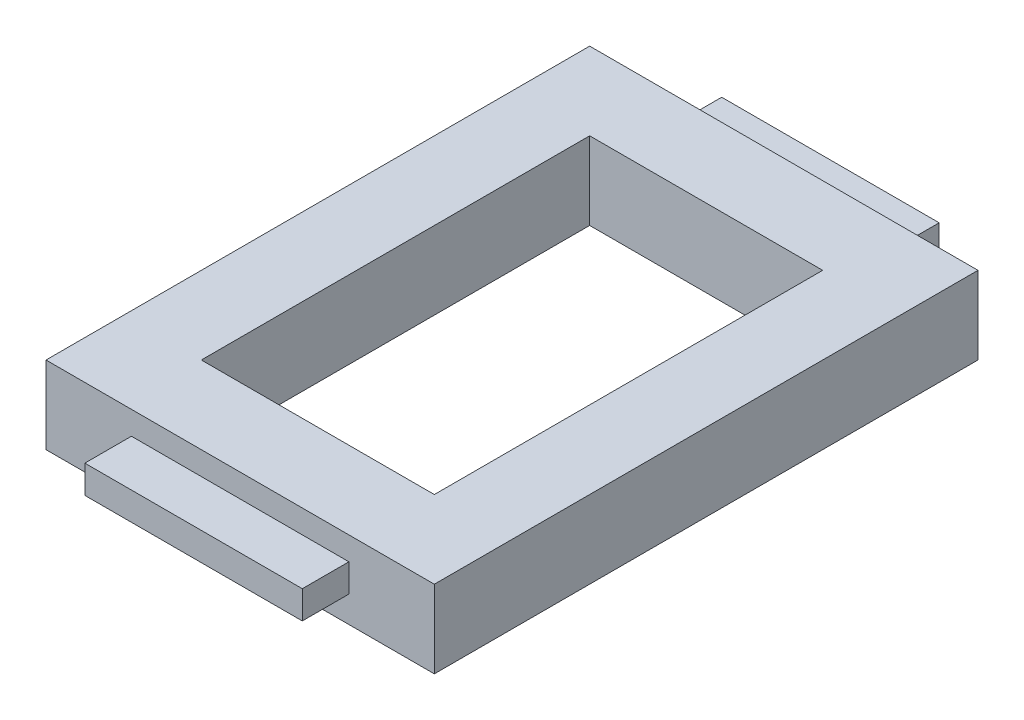
ISO-10303-21;
HEADER;
FILE_DESCRIPTION(('STEP AP214'),'2;1');
FILE_NAME('part.step','',(''),(''),'','','');
FILE_SCHEMA(('AUTOMOTIVE_DESIGN { 1 0 10303 214 1 1 1 1 }'));
ENDSEC;
DATA;
#1=APPLICATION_CONTEXT('core data for automotive mechanical design processes');
#2=APPLICATION_PROTOCOL_DEFINITION('international standard','automotive_design',2000,#1);
#3=PRODUCT_CONTEXT('',#1,'mechanical');
#4=PRODUCT('Part','Part','',(#3));
#5=PRODUCT_RELATED_PRODUCT_CATEGORY('part','',(#4));
#6=PRODUCT_DEFINITION_FORMATION('','',#4);
#7=PRODUCT_DEFINITION_CONTEXT('part definition',#1,'design');
#8=PRODUCT_DEFINITION('design','',#6,#7);
#9=PRODUCT_DEFINITION_SHAPE('','',#8);
#10=(LENGTH_UNIT() NAMED_UNIT(*) SI_UNIT(.MILLI.,.METRE.));
#11=(NAMED_UNIT(*) PLANE_ANGLE_UNIT() SI_UNIT($,.RADIAN.));
#12=(NAMED_UNIT(*) SI_UNIT($,.STERADIAN.) SOLID_ANGLE_UNIT());
#13=UNCERTAINTY_MEASURE_WITH_UNIT(LENGTH_MEASURE(1.E-05),#10,'distance_accuracy_value','');
#14=(GEOMETRIC_REPRESENTATION_CONTEXT(3) GLOBAL_UNCERTAINTY_ASSIGNED_CONTEXT((#13)) GLOBAL_UNIT_ASSIGNED_CONTEXT((#10,
#11,#12)) REPRESENTATION_CONTEXT('',''));
#15=CARTESIAN_POINT('',(0.,0.,0.));
#16=DIRECTION('',(0.,0.,1.));
#17=DIRECTION('',(1.,0.,0.));
#18=AXIS2_PLACEMENT_3D('',#15,#16,#17);
#19=CARTESIAN_POINT('',(0.,5.,-35.));
#20=DIRECTION('',(0.,0.,1.));
#21=DIRECTION('',(1.,0.,0.));
#22=AXIS2_PLACEMENT_3D('',#19,#20,#21);
#23=PLANE('',#22);
#24=DIRECTION('',(-1.,0.,0.));
#25=VECTOR('',#24,1.);
#26=CARTESIAN_POINT('',(0.,0.,-35.));
#27=LINE('',#26,#25);
#28=CARTESIAN_POINT('',(25.,0.,-35.));
#29=VERTEX_POINT('',#28);
#30=CARTESIAN_POINT('',(0.,0.,-35.));
#31=VERTEX_POINT('',#30);
#32=EDGE_CURVE('E240',#29,#31,#27,.T.);
#33=ORIENTED_EDGE('',*,*,#32,.T.);
#34=DIRECTION('',(0.,-1.,0.));
#35=VECTOR('',#34,1.);
#36=CARTESIAN_POINT('',(0.,5.,-35.));
#37=LINE('',#36,#35);
#38=CARTESIAN_POINT('',(0.,5.,-35.));
#39=VERTEX_POINT('',#38);
#40=EDGE_CURVE('E246',#39,#31,#37,.T.);
#41=ORIENTED_EDGE('',*,*,#40,.F.);
#42=DIRECTION('',(-1.,0.,0.));
#43=VECTOR('',#42,1.);
#44=CARTESIAN_POINT('',(0.,5.,-35.));
#45=LINE('',#44,#43);
#46=CARTESIAN_POINT('',(25.,5.,-35.));
#47=VERTEX_POINT('',#46);
#48=EDGE_CURVE('E244',#47,#39,#45,.T.);
#49=ORIENTED_EDGE('',*,*,#48,.F.);
#50=DIRECTION('',(0.,-1.,0.));
#51=VECTOR('',#50,1.);
#52=CARTESIAN_POINT('',(25.,5.,-35.));
#53=LINE('',#52,#51);
#54=EDGE_CURVE('E256',#47,#29,#53,.T.);
#55=ORIENTED_EDGE('',*,*,#54,.T.);
#56=EDGE_LOOP('',(#33,#41,#49,#55));
#57=FACE_BOUND('',#56,.T.);
#58=DIRECTION('',(0.,-1.,0.));
#59=VECTOR('',#58,1.);
#60=CARTESIAN_POINT('',(19.5,3.4,-35.));
#61=LINE('',#60,#59);
#62=CARTESIAN_POINT('',(19.5,3.4,-35.));
#63=VERTEX_POINT('',#62);
#64=CARTESIAN_POINT('',(19.5,1.6,-35.));
#65=VERTEX_POINT('',#64);
#66=EDGE_CURVE('E48',#63,#65,#61,.T.);
#67=ORIENTED_EDGE('',*,*,#66,.F.);
#68=DIRECTION('',(1.,0.,0.));
#69=VECTOR('',#68,1.);
#70=CARTESIAN_POINT('',(19.5,3.4,-35.));
#71=LINE('',#70,#69);
#72=CARTESIAN_POINT('',(5.5,3.4,-35.));
#73=VERTEX_POINT('',#72);
#74=EDGE_CURVE('E52',#73,#63,#71,.T.);
#75=ORIENTED_EDGE('',*,*,#74,.F.);
#76=DIRECTION('',(0.,1.,0.));
#77=VECTOR('',#76,1.);
#78=CARTESIAN_POINT('',(5.5,3.4,-35.));
#79=LINE('',#78,#77);
#80=CARTESIAN_POINT('',(5.5,1.6,-35.));
#81=VERTEX_POINT('',#80);
#82=EDGE_CURVE('E444',#81,#73,#79,.T.);
#83=ORIENTED_EDGE('',*,*,#82,.F.);
#84=DIRECTION('',(-1.,0.,0.));
#85=VECTOR('',#84,1.);
#86=CARTESIAN_POINT('',(19.5,1.6,-35.));
#87=LINE('',#86,#85);
#88=EDGE_CURVE('E450',#65,#81,#87,.T.);
#89=ORIENTED_EDGE('',*,*,#88,.F.);
#90=EDGE_LOOP('',(#67,#75,#83,#89));
#91=FACE_BOUND('',#90,.T.);
#92=ADVANCED_FACE('F33',(#57,#91),#23,.F.);
#93=CARTESIAN_POINT('',(0.,5.,0.));
#94=DIRECTION('',(0.,0.,-1.));
#95=DIRECTION('',(-1.,0.,0.));
#96=AXIS2_PLACEMENT_3D('',#93,#94,#95);
#97=PLANE('',#96);
#98=DIRECTION('',(1.,0.,0.));
#99=VECTOR('',#98,1.);
#100=CARTESIAN_POINT('',(0.,0.,0.));
#101=LINE('',#100,#99);
#102=CARTESIAN_POINT('',(0.,0.,0.));
#103=VERTEX_POINT('',#102);
#104=CARTESIAN_POINT('',(25.,0.,0.));
#105=VERTEX_POINT('',#104);
#106=EDGE_CURVE('E249',#103,#105,#101,.T.);
#107=ORIENTED_EDGE('',*,*,#106,.T.);
#108=DIRECTION('',(0.,-1.,0.));
#109=VECTOR('',#108,1.);
#110=CARTESIAN_POINT('',(25.,5.,0.));
#111=LINE('',#110,#109);
#112=CARTESIAN_POINT('',(25.,5.,0.));
#113=VERTEX_POINT('',#112);
#114=EDGE_CURVE('E41',#113,#105,#111,.T.);
#115=ORIENTED_EDGE('',*,*,#114,.F.);
#116=DIRECTION('',(1.,0.,0.));
#117=VECTOR('',#116,1.);
#118=CARTESIAN_POINT('',(0.,5.,0.));
#119=LINE('',#118,#117);
#120=CARTESIAN_POINT('',(0.,5.,0.));
#121=VERTEX_POINT('',#120);
#122=EDGE_CURVE('E239',#121,#113,#119,.T.);
#123=ORIENTED_EDGE('',*,*,#122,.F.);
#124=DIRECTION('',(0.,-1.,0.));
#125=VECTOR('',#124,1.);
#126=CARTESIAN_POINT('',(0.,5.,0.));
#127=LINE('',#126,#125);
#128=EDGE_CURVE('E11',#121,#103,#127,.T.);
#129=ORIENTED_EDGE('',*,*,#128,.T.);
#130=EDGE_LOOP('',(#107,#115,#123,#129));
#131=FACE_BOUND('',#130,.T.);
#132=DIRECTION('',(0.,-1.,0.));
#133=VECTOR('',#132,1.);
#134=CARTESIAN_POINT('',(5.5,3.5,0.));
#135=LINE('',#134,#133);
#136=CARTESIAN_POINT('',(5.5,3.5,0.));
#137=VERTEX_POINT('',#136);
#138=CARTESIAN_POINT('',(5.5,1.7,0.));
#139=VERTEX_POINT('',#138);
#140=EDGE_CURVE('E166',#137,#139,#135,.T.);
#141=ORIENTED_EDGE('',*,*,#140,.F.);
#142=DIRECTION('',(-1.,0.,0.));
#143=VECTOR('',#142,1.);
#144=CARTESIAN_POINT('',(5.5,3.5,0.));
#145=LINE('',#144,#143);
#146=CARTESIAN_POINT('',(19.5,3.5,0.));
#147=VERTEX_POINT('',#146);
#148=EDGE_CURVE('E179',#147,#137,#145,.T.);
#149=ORIENTED_EDGE('',*,*,#148,.F.);
#150=DIRECTION('',(0.,1.,0.));
#151=VECTOR('',#150,1.);
#152=CARTESIAN_POINT('',(19.5,3.5,0.));
#153=LINE('',#152,#151);
#154=CARTESIAN_POINT('',(19.5,1.7,0.));
#155=VERTEX_POINT('',#154);
#156=EDGE_CURVE('E188',#155,#147,#153,.T.);
#157=ORIENTED_EDGE('',*,*,#156,.F.);
#158=DIRECTION('',(1.,0.,0.));
#159=VECTOR('',#158,1.);
#160=CARTESIAN_POINT('',(5.5,1.7,0.));
#161=LINE('',#160,#159);
#162=EDGE_CURVE('E169',#139,#155,#161,.T.);
#163=ORIENTED_EDGE('',*,*,#162,.F.);
#164=EDGE_LOOP('',(#141,#149,#157,#163));
#165=FACE_BOUND('',#164,.T.);
#166=ADVANCED_FACE('F280',(#131,#165),#97,.F.);
#167=CARTESIAN_POINT('',(0.,5.,0.));
#168=DIRECTION('',(0.,-1.,0.));
#169=DIRECTION('',(0.,0.,-1.));
#170=AXIS2_PLACEMENT_3D('',#167,#168,#169);
#171=PLANE('',#170);
#172=DIRECTION('',(0.,0.,1.));
#173=VECTOR('',#172,1.);
#174=CARTESIAN_POINT('',(0.,5.,0.));
#175=LINE('',#174,#173);
#176=EDGE_CURVE('E236',#39,#121,#175,.T.);
#177=ORIENTED_EDGE('',*,*,#176,.T.);
#178=ORIENTED_EDGE('',*,*,#122,.T.);
#179=DIRECTION('',(0.,0.,-1.));
#180=VECTOR('',#179,1.);
#181=CARTESIAN_POINT('',(25.,5.,0.));
#182=LINE('',#181,#180);
#183=EDGE_CURVE('E242',#113,#47,#182,.T.);
#184=ORIENTED_EDGE('',*,*,#183,.T.);
#185=ORIENTED_EDGE('',*,*,#48,.T.);
#186=EDGE_LOOP('',(#177,#178,#184,#185));
#187=FACE_BOUND('',#186,.T.);
#188=DIRECTION('',(0.,0.,1.));
#189=VECTOR('',#188,1.);
#190=CARTESIAN_POINT('',(5.,5.,-30.));
#191=LINE('',#190,#189);
#192=CARTESIAN_POINT('',(5.,5.,-30.));
#193=VERTEX_POINT('',#192);
#194=CARTESIAN_POINT('',(5.,5.,-5.));
#195=VERTEX_POINT('',#194);
#196=EDGE_CURVE('E205',#193,#195,#191,.T.);
#197=ORIENTED_EDGE('',*,*,#196,.F.);
#198=DIRECTION('',(-1.,0.,0.));
#199=VECTOR('',#198,1.);
#200=CARTESIAN_POINT('',(5.,5.,-30.));
#201=LINE('',#200,#199);
#202=CARTESIAN_POINT('',(20.,5.,-30.));
#203=VERTEX_POINT('',#202);
#204=EDGE_CURVE('E213',#203,#193,#201,.T.);
#205=ORIENTED_EDGE('',*,*,#204,.F.);
#206=DIRECTION('',(0.,0.,-1.));
#207=VECTOR('',#206,1.);
#208=CARTESIAN_POINT('',(20.,5.,-30.));
#209=LINE('',#208,#207);
#210=CARTESIAN_POINT('',(20.,5.,-5.));
#211=VERTEX_POINT('',#210);
#212=EDGE_CURVE('E210',#211,#203,#209,.T.);
#213=ORIENTED_EDGE('',*,*,#212,.F.);
#214=DIRECTION('',(1.,0.,0.));
#215=VECTOR('',#214,1.);
#216=CARTESIAN_POINT('',(5.,5.,-5.));
#217=LINE('',#216,#215);
#218=EDGE_CURVE('E207',#195,#211,#217,.T.);
#219=ORIENTED_EDGE('',*,*,#218,.F.);
#220=EDGE_LOOP('',(#197,#205,#213,#219));
#221=FACE_BOUND('',#220,.T.);
#222=ADVANCED_FACE('F278',(#187,#221),#171,.F.);
#223=CARTESIAN_POINT('',(0.,0.,0.));
#224=DIRECTION('',(0.,-1.,0.));
#225=DIRECTION('',(0.,0.,-1.));
#226=AXIS2_PLACEMENT_3D('',#223,#224,#225);
#227=PLANE('',#226);
#228=DIRECTION('',(0.,0.,1.));
#229=VECTOR('',#228,1.);
#230=CARTESIAN_POINT('',(0.,0.,0.));
#231=LINE('',#230,#229);
#232=EDGE_CURVE('E235',#31,#103,#231,.T.);
#233=ORIENTED_EDGE('',*,*,#232,.F.);
#234=ORIENTED_EDGE('',*,*,#32,.F.);
#235=DIRECTION('',(0.,0.,-1.));
#236=VECTOR('',#235,1.);
#237=CARTESIAN_POINT('',(25.,0.,0.));
#238=LINE('',#237,#236);
#239=EDGE_CURVE('E251',#105,#29,#238,.T.);
#240=ORIENTED_EDGE('',*,*,#239,.F.);
#241=ORIENTED_EDGE('',*,*,#106,.F.);
#242=EDGE_LOOP('',(#233,#234,#240,#241));
#243=FACE_BOUND('',#242,.T.);
#244=DIRECTION('',(-1.,0.,0.));
#245=VECTOR('',#244,1.);
#246=CARTESIAN_POINT('',(5.,0.,-30.));
#247=LINE('',#246,#245);
#248=CARTESIAN_POINT('',(20.,0.,-30.));
#249=VERTEX_POINT('',#248);
#250=CARTESIAN_POINT('',(5.,0.,-30.));
#251=VERTEX_POINT('',#250);
#252=EDGE_CURVE('E208',#249,#251,#247,.T.);
#253=ORIENTED_EDGE('',*,*,#252,.T.);
#254=DIRECTION('',(0.,0.,1.));
#255=VECTOR('',#254,1.);
#256=CARTESIAN_POINT('',(5.,0.,-30.));
#257=LINE('',#256,#255);
#258=CARTESIAN_POINT('',(5.,0.,-5.));
#259=VERTEX_POINT('',#258);
#260=EDGE_CURVE('E204',#251,#259,#257,.T.);
#261=ORIENTED_EDGE('',*,*,#260,.T.);
#262=DIRECTION('',(1.,0.,0.));
#263=VECTOR('',#262,1.);
#264=CARTESIAN_POINT('',(5.,0.,-5.));
#265=LINE('',#264,#263);
#266=CARTESIAN_POINT('',(20.,0.,-5.));
#267=VERTEX_POINT('',#266);
#268=EDGE_CURVE('E218',#259,#267,#265,.T.);
#269=ORIENTED_EDGE('',*,*,#268,.T.);
#270=DIRECTION('',(0.,0.,-1.));
#271=VECTOR('',#270,1.);
#272=CARTESIAN_POINT('',(20.,0.,-30.));
#273=LINE('',#272,#271);
#274=EDGE_CURVE('E221',#267,#249,#273,.T.);
#275=ORIENTED_EDGE('',*,*,#274,.T.);
#276=EDGE_LOOP('',(#253,#261,#269,#275));
#277=FACE_BOUND('',#276,.T.);
#278=ADVANCED_FACE('F269',(#243,#277),#227,.T.);
#279=CARTESIAN_POINT('',(0.,5.,0.));
#280=DIRECTION('',(1.,0.,0.));
#281=DIRECTION('',(0.,0.,-1.));
#282=AXIS2_PLACEMENT_3D('',#279,#280,#281);
#283=PLANE('',#282);
#284=ORIENTED_EDGE('',*,*,#232,.T.);
#285=ORIENTED_EDGE('',*,*,#128,.F.);
#286=ORIENTED_EDGE('',*,*,#176,.F.);
#287=ORIENTED_EDGE('',*,*,#40,.T.);
#288=EDGE_LOOP('',(#284,#285,#286,#287));
#289=FACE_BOUND('',#288,.T.);
#290=ADVANCED_FACE('F35',(#289),#283,.F.);
#291=CARTESIAN_POINT('',(25.,5.,0.));
#292=DIRECTION('',(-1.,0.,0.));
#293=DIRECTION('',(0.,0.,1.));
#294=AXIS2_PLACEMENT_3D('',#291,#292,#293);
#295=PLANE('',#294);
#296=ORIENTED_EDGE('',*,*,#239,.T.);
#297=ORIENTED_EDGE('',*,*,#54,.F.);
#298=ORIENTED_EDGE('',*,*,#183,.F.);
#299=ORIENTED_EDGE('',*,*,#114,.T.);
#300=EDGE_LOOP('',(#296,#297,#298,#299));
#301=FACE_BOUND('',#300,.T.);
#302=ADVANCED_FACE('F263',(#301),#295,.F.);
#303=CARTESIAN_POINT('',(5.,5.,-30.));
#304=DIRECTION('',(1.,0.,0.));
#305=DIRECTION('',(0.,0.,-1.));
#306=AXIS2_PLACEMENT_3D('',#303,#304,#305);
#307=PLANE('',#306);
#308=ORIENTED_EDGE('',*,*,#260,.F.);
#309=DIRECTION('',(0.,-1.,0.));
#310=VECTOR('',#309,1.);
#311=CARTESIAN_POINT('',(5.,5.,-30.));
#312=LINE('',#311,#310);
#313=EDGE_CURVE('E215',#193,#251,#312,.T.);
#314=ORIENTED_EDGE('',*,*,#313,.F.);
#315=ORIENTED_EDGE('',*,*,#196,.T.);
#316=DIRECTION('',(0.,-1.,0.));
#317=VECTOR('',#316,1.);
#318=CARTESIAN_POINT('',(5.,5.,-5.));
#319=LINE('',#318,#317);
#320=EDGE_CURVE('E232',#195,#259,#319,.T.);
#321=ORIENTED_EDGE('',*,*,#320,.T.);
#322=EDGE_LOOP('',(#308,#314,#315,#321));
#323=FACE_BOUND('',#322,.T.);
#324=ADVANCED_FACE('F317',(#323),#307,.T.);
#325=CARTESIAN_POINT('',(5.,5.,-5.));
#326=DIRECTION('',(0.,0.,-1.));
#327=DIRECTION('',(-1.,0.,0.));
#328=AXIS2_PLACEMENT_3D('',#325,#326,#327);
#329=PLANE('',#328);
#330=ORIENTED_EDGE('',*,*,#268,.F.);
#331=ORIENTED_EDGE('',*,*,#320,.F.);
#332=ORIENTED_EDGE('',*,*,#218,.T.);
#333=DIRECTION('',(0.,-1.,0.));
#334=VECTOR('',#333,1.);
#335=CARTESIAN_POINT('',(20.,5.,-5.));
#336=LINE('',#335,#334);
#337=EDGE_CURVE('E230',#211,#267,#336,.T.);
#338=ORIENTED_EDGE('',*,*,#337,.T.);
#339=EDGE_LOOP('',(#330,#331,#332,#338));
#340=FACE_BOUND('',#339,.T.);
#341=ADVANCED_FACE('F322',(#340),#329,.T.);
#342=CARTESIAN_POINT('',(20.,5.,-30.));
#343=DIRECTION('',(-1.,0.,0.));
#344=DIRECTION('',(0.,0.,1.));
#345=AXIS2_PLACEMENT_3D('',#342,#343,#344);
#346=PLANE('',#345);
#347=ORIENTED_EDGE('',*,*,#274,.F.);
#348=ORIENTED_EDGE('',*,*,#337,.F.);
#349=ORIENTED_EDGE('',*,*,#212,.T.);
#350=DIRECTION('',(0.,-1.,0.));
#351=VECTOR('',#350,1.);
#352=CARTESIAN_POINT('',(20.,5.,-30.));
#353=LINE('',#352,#351);
#354=EDGE_CURVE('E228',#203,#249,#353,.T.);
#355=ORIENTED_EDGE('',*,*,#354,.T.);
#356=EDGE_LOOP('',(#347,#348,#349,#355));
#357=FACE_BOUND('',#356,.T.);
#358=ADVANCED_FACE('F336',(#357),#346,.T.);
#359=CARTESIAN_POINT('',(5.,5.,-30.));
#360=DIRECTION('',(0.,0.,1.));
#361=DIRECTION('',(1.,0.,0.));
#362=AXIS2_PLACEMENT_3D('',#359,#360,#361);
#363=PLANE('',#362);
#364=ORIENTED_EDGE('',*,*,#252,.F.);
#365=ORIENTED_EDGE('',*,*,#354,.F.);
#366=ORIENTED_EDGE('',*,*,#204,.T.);
#367=ORIENTED_EDGE('',*,*,#313,.T.);
#368=EDGE_LOOP('',(#364,#365,#366,#367));
#369=FACE_BOUND('',#368,.T.);
#370=ADVANCED_FACE('F307',(#369),#363,.T.);
#371=CARTESIAN_POINT('',(5.5,3.5,3.));
#372=DIRECTION('',(1.,0.,0.));
#373=DIRECTION('',(0.,0.,-1.));
#374=AXIS2_PLACEMENT_3D('',#371,#372,#373);
#375=PLANE('',#374);
#376=ORIENTED_EDGE('',*,*,#140,.T.);
#377=DIRECTION('',(0.,0.,-1.));
#378=VECTOR('',#377,1.);
#379=CARTESIAN_POINT('',(5.5,1.7,3.));
#380=LINE('',#379,#378);
#381=CARTESIAN_POINT('',(5.5,1.7,3.));
#382=VERTEX_POINT('',#381);
#383=EDGE_CURVE('E201',#382,#139,#380,.T.);
#384=ORIENTED_EDGE('',*,*,#383,.F.);
#385=DIRECTION('',(0.,-1.,0.));
#386=VECTOR('',#385,1.);
#387=CARTESIAN_POINT('',(5.5,3.5,3.));
#388=LINE('',#387,#386);
#389=CARTESIAN_POINT('',(5.5,3.5,3.));
#390=VERTEX_POINT('',#389);
#391=EDGE_CURVE('E175',#390,#382,#388,.T.);
#392=ORIENTED_EDGE('',*,*,#391,.F.);
#393=DIRECTION('',(0.,0.,-1.));
#394=VECTOR('',#393,1.);
#395=CARTESIAN_POINT('',(5.5,3.5,3.));
#396=LINE('',#395,#394);
#397=EDGE_CURVE('E184',#390,#137,#396,.T.);
#398=ORIENTED_EDGE('',*,*,#397,.T.);
#399=EDGE_LOOP('',(#376,#384,#392,#398));
#400=FACE_BOUND('',#399,.T.);
#401=ADVANCED_FACE('F291',(#400),#375,.F.);
#402=CARTESIAN_POINT('',(5.5,1.7,3.));
#403=DIRECTION('',(0.,1.,0.));
#404=DIRECTION('',(0.,0.,1.));
#405=AXIS2_PLACEMENT_3D('',#402,#403,#404);
#406=PLANE('',#405);
#407=ORIENTED_EDGE('',*,*,#162,.T.);
#408=DIRECTION('',(0.,0.,-1.));
#409=VECTOR('',#408,1.);
#410=CARTESIAN_POINT('',(19.5,1.7,3.));
#411=LINE('',#410,#409);
#412=CARTESIAN_POINT('',(19.5,1.7,3.));
#413=VERTEX_POINT('',#412);
#414=EDGE_CURVE('E198',#413,#155,#411,.T.);
#415=ORIENTED_EDGE('',*,*,#414,.F.);
#416=DIRECTION('',(1.,0.,0.));
#417=VECTOR('',#416,1.);
#418=CARTESIAN_POINT('',(5.5,1.7,3.));
#419=LINE('',#418,#417);
#420=EDGE_CURVE('E178',#382,#413,#419,.T.);
#421=ORIENTED_EDGE('',*,*,#420,.F.);
#422=ORIENTED_EDGE('',*,*,#383,.T.);
#423=EDGE_LOOP('',(#407,#415,#421,#422));
#424=FACE_BOUND('',#423,.T.);
#425=ADVANCED_FACE('F299',(#424),#406,.F.);
#426=CARTESIAN_POINT('',(19.5,3.5,3.));
#427=DIRECTION('',(-1.,0.,0.));
#428=DIRECTION('',(0.,0.,1.));
#429=AXIS2_PLACEMENT_3D('',#426,#427,#428);
#430=PLANE('',#429);
#431=ORIENTED_EDGE('',*,*,#156,.T.);
#432=DIRECTION('',(0.,0.,-1.));
#433=VECTOR('',#432,1.);
#434=CARTESIAN_POINT('',(19.5,3.5,3.));
#435=LINE('',#434,#433);
#436=CARTESIAN_POINT('',(19.5,3.5,3.));
#437=VERTEX_POINT('',#436);
#438=EDGE_CURVE('E195',#437,#147,#435,.T.);
#439=ORIENTED_EDGE('',*,*,#438,.F.);
#440=DIRECTION('',(0.,1.,0.));
#441=VECTOR('',#440,1.);
#442=CARTESIAN_POINT('',(19.5,3.5,3.));
#443=LINE('',#442,#441);
#444=EDGE_CURVE('E181',#413,#437,#443,.T.);
#445=ORIENTED_EDGE('',*,*,#444,.F.);
#446=ORIENTED_EDGE('',*,*,#414,.T.);
#447=EDGE_LOOP('',(#431,#439,#445,#446));
#448=FACE_BOUND('',#447,.T.);
#449=ADVANCED_FACE('F297',(#448),#430,.F.);
#450=CARTESIAN_POINT('',(5.5,3.5,3.));
#451=DIRECTION('',(0.,-1.,0.));
#452=DIRECTION('',(0.,0.,-1.));
#453=AXIS2_PLACEMENT_3D('',#450,#451,#452);
#454=PLANE('',#453);
#455=ORIENTED_EDGE('',*,*,#148,.T.);
#456=ORIENTED_EDGE('',*,*,#397,.F.);
#457=DIRECTION('',(-1.,0.,0.));
#458=VECTOR('',#457,1.);
#459=CARTESIAN_POINT('',(5.5,3.5,3.));
#460=LINE('',#459,#458);
#461=EDGE_CURVE('E183',#437,#390,#460,.T.);
#462=ORIENTED_EDGE('',*,*,#461,.F.);
#463=ORIENTED_EDGE('',*,*,#438,.T.);
#464=EDGE_LOOP('',(#455,#456,#462,#463));
#465=FACE_BOUND('',#464,.T.);
#466=ADVANCED_FACE('F287',(#465),#454,.F.);
#467=CARTESIAN_POINT('',(0.,0.,3.));
#468=DIRECTION('',(0.,0.,1.));
#469=DIRECTION('',(1.,0.,0.));
#470=AXIS2_PLACEMENT_3D('',#467,#468,#469);
#471=PLANE('',#470);
#472=ORIENTED_EDGE('',*,*,#391,.T.);
#473=ORIENTED_EDGE('',*,*,#420,.T.);
#474=ORIENTED_EDGE('',*,*,#444,.T.);
#475=ORIENTED_EDGE('',*,*,#461,.T.);
#476=EDGE_LOOP('',(#472,#473,#474,#475));
#477=FACE_BOUND('',#476,.T.);
#478=ADVANCED_FACE('F293',(#477),#471,.T.);
#479=CARTESIAN_POINT('',(19.5,3.4,-38.));
#480=DIRECTION('',(-1.,0.,0.));
#481=DIRECTION('',(0.,0.,1.));
#482=AXIS2_PLACEMENT_3D('',#479,#480,#481);
#483=PLANE('',#482);
#484=ORIENTED_EDGE('',*,*,#66,.T.);
#485=DIRECTION('',(0.,0.,1.));
#486=VECTOR('',#485,1.);
#487=CARTESIAN_POINT('',(19.5,1.6,-38.));
#488=LINE('',#487,#486);
#489=CARTESIAN_POINT('',(19.5,1.6,-38.));
#490=VERTEX_POINT('',#489);
#491=EDGE_CURVE('E149',#490,#65,#488,.T.);
#492=ORIENTED_EDGE('',*,*,#491,.F.);
#493=DIRECTION('',(0.,-1.,0.));
#494=VECTOR('',#493,1.);
#495=CARTESIAN_POINT('',(19.5,3.4,-38.));
#496=LINE('',#495,#494);
#497=CARTESIAN_POINT('',(19.5,3.4,-38.));
#498=VERTEX_POINT('',#497);
#499=EDGE_CURVE('E155',#498,#490,#496,.T.);
#500=ORIENTED_EDGE('',*,*,#499,.F.);
#501=DIRECTION('',(0.,0.,1.));
#502=VECTOR('',#501,1.);
#503=CARTESIAN_POINT('',(19.5,3.4,-38.));
#504=LINE('',#503,#502);
#505=EDGE_CURVE('E442',#498,#63,#504,.T.);
#506=ORIENTED_EDGE('',*,*,#505,.T.);
#507=EDGE_LOOP('',(#484,#492,#500,#506));
#508=FACE_BOUND('',#507,.T.);
#509=ADVANCED_FACE('F165',(#508),#483,.F.);
#510=CARTESIAN_POINT('',(19.5,1.6,-38.));
#511=DIRECTION('',(0.,1.,0.));
#512=DIRECTION('',(0.,0.,1.));
#513=AXIS2_PLACEMENT_3D('',#510,#511,#512);
#514=PLANE('',#513);
#515=ORIENTED_EDGE('',*,*,#88,.T.);
#516=DIRECTION('',(0.,0.,1.));
#517=VECTOR('',#516,1.);
#518=CARTESIAN_POINT('',(5.5,1.6,-38.));
#519=LINE('',#518,#517);
#520=CARTESIAN_POINT('',(5.5,1.6,-38.));
#521=VERTEX_POINT('',#520);
#522=EDGE_CURVE('E151',#521,#81,#519,.T.);
#523=ORIENTED_EDGE('',*,*,#522,.F.);
#524=DIRECTION('',(-1.,0.,0.));
#525=VECTOR('',#524,1.);
#526=CARTESIAN_POINT('',(19.5,1.6,-38.));
#527=LINE('',#526,#525);
#528=EDGE_CURVE('E144',#490,#521,#527,.T.);
#529=ORIENTED_EDGE('',*,*,#528,.F.);
#530=ORIENTED_EDGE('',*,*,#491,.T.);
#531=EDGE_LOOP('',(#515,#523,#529,#530));
#532=FACE_BOUND('',#531,.T.);
#533=ADVANCED_FACE('F147',(#532),#514,.F.);
#534=CARTESIAN_POINT('',(5.5,3.4,-38.));
#535=DIRECTION('',(1.,0.,0.));
#536=DIRECTION('',(0.,0.,-1.));
#537=AXIS2_PLACEMENT_3D('',#534,#535,#536);
#538=PLANE('',#537);
#539=ORIENTED_EDGE('',*,*,#82,.T.);
#540=DIRECTION('',(0.,0.,1.));
#541=VECTOR('',#540,1.);
#542=CARTESIAN_POINT('',(5.5,3.4,-38.));
#543=LINE('',#542,#541);
#544=CARTESIAN_POINT('',(5.5,3.4,-38.));
#545=VERTEX_POINT('',#544);
#546=EDGE_CURVE('E171',#545,#73,#543,.T.);
#547=ORIENTED_EDGE('',*,*,#546,.F.);
#548=DIRECTION('',(0.,1.,0.));
#549=VECTOR('',#548,1.);
#550=CARTESIAN_POINT('',(5.5,3.4,-38.));
#551=LINE('',#550,#549);
#552=EDGE_CURVE('E154',#521,#545,#551,.T.);
#553=ORIENTED_EDGE('',*,*,#552,.F.);
#554=ORIENTED_EDGE('',*,*,#522,.T.);
#555=EDGE_LOOP('',(#539,#547,#553,#554));
#556=FACE_BOUND('',#555,.T.);
#557=ADVANCED_FACE('F410',(#556),#538,.F.);
#558=CARTESIAN_POINT('',(19.5,3.4,-38.));
#559=DIRECTION('',(0.,-1.,0.));
#560=DIRECTION('',(0.,0.,-1.));
#561=AXIS2_PLACEMENT_3D('',#558,#559,#560);
#562=PLANE('',#561);
#563=ORIENTED_EDGE('',*,*,#74,.T.);
#564=ORIENTED_EDGE('',*,*,#505,.F.);
#565=DIRECTION('',(1.,0.,0.));
#566=VECTOR('',#565,1.);
#567=CARTESIAN_POINT('',(19.5,3.4,-38.));
#568=LINE('',#567,#566);
#569=EDGE_CURVE('E160',#545,#498,#568,.T.);
#570=ORIENTED_EDGE('',*,*,#569,.F.);
#571=ORIENTED_EDGE('',*,*,#546,.T.);
#572=EDGE_LOOP('',(#563,#564,#570,#571));
#573=FACE_BOUND('',#572,.T.);
#574=ADVANCED_FACE('F419',(#573),#562,.F.);
#575=CARTESIAN_POINT('',(0.,0.,-38.));
#576=DIRECTION('',(0.,0.,-1.));
#577=DIRECTION('',(-1.,0.,0.));
#578=AXIS2_PLACEMENT_3D('',#575,#576,#577);
#579=PLANE('',#578);
#580=ORIENTED_EDGE('',*,*,#499,.T.);
#581=ORIENTED_EDGE('',*,*,#528,.T.);
#582=ORIENTED_EDGE('',*,*,#552,.T.);
#583=ORIENTED_EDGE('',*,*,#569,.T.);
#584=EDGE_LOOP('',(#580,#581,#582,#583));
#585=FACE_BOUND('',#584,.T.);
#586=ADVANCED_FACE('F158',(#585),#579,.T.);
#587=CLOSED_SHELL('',(#92,#166,#222,#278,#290,#302,#324,#341,#358,#370,#401,#425,#449,#466,#478,
#509,#533,#557,#574,#586));
#588=MANIFOLD_SOLID_BREP('B2',#587);
#589=ADVANCED_BREP_SHAPE_REPRESENTATION('',(#18,#588),#14);
#590=SHAPE_DEFINITION_REPRESENTATION(#9,#589);
ENDSEC;
END-ISO-10303-21;
